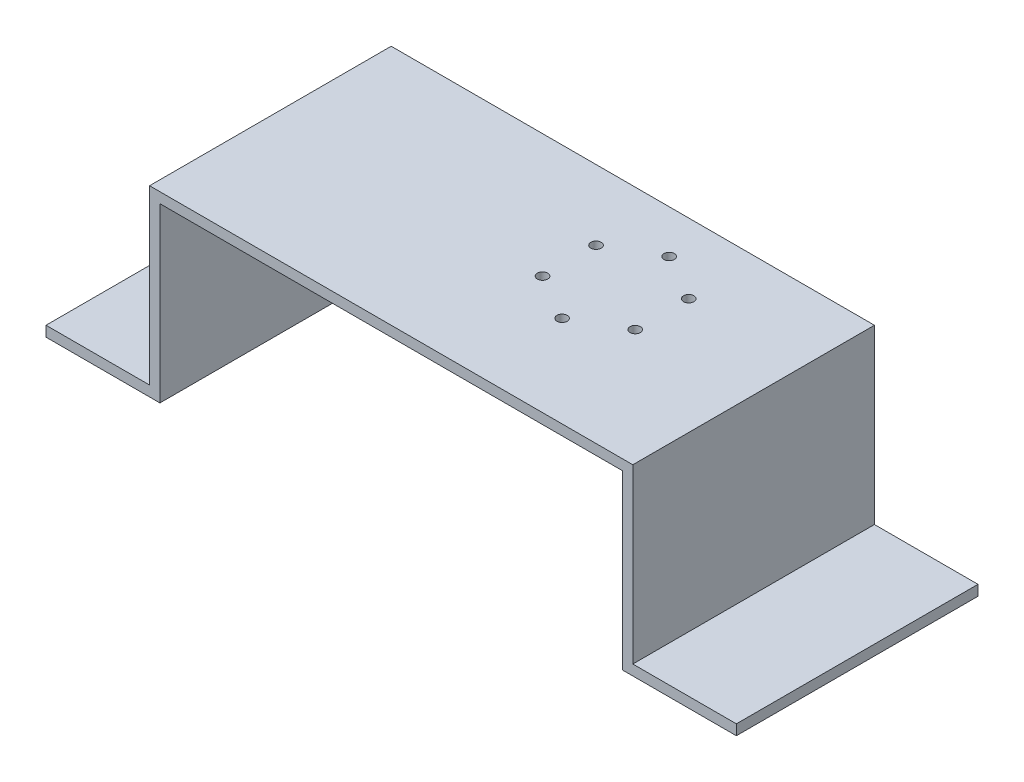
ISO-10303-21;
HEADER;
FILE_DESCRIPTION(('STEP AP214'),'2;1');
FILE_NAME('part.step','',(''),(''),'','','');
FILE_SCHEMA(('AUTOMOTIVE_DESIGN { 1 0 10303 214 1 1 1 1 }'));
ENDSEC;
DATA;
#1=APPLICATION_CONTEXT('core data for automotive mechanical design processes');
#2=APPLICATION_PROTOCOL_DEFINITION('international standard','automotive_design',2000,#1);
#3=PRODUCT_CONTEXT('',#1,'mechanical');
#4=PRODUCT('Part','Part','',(#3));
#5=PRODUCT_RELATED_PRODUCT_CATEGORY('part','',(#4));
#6=PRODUCT_DEFINITION_FORMATION('','',#4);
#7=PRODUCT_DEFINITION_CONTEXT('part definition',#1,'design');
#8=PRODUCT_DEFINITION('design','',#6,#7);
#9=PRODUCT_DEFINITION_SHAPE('','',#8);
#10=(LENGTH_UNIT() NAMED_UNIT(*) SI_UNIT(.MILLI.,.METRE.));
#11=(NAMED_UNIT(*) PLANE_ANGLE_UNIT() SI_UNIT($,.RADIAN.));
#12=(NAMED_UNIT(*) SI_UNIT($,.STERADIAN.) SOLID_ANGLE_UNIT());
#13=UNCERTAINTY_MEASURE_WITH_UNIT(LENGTH_MEASURE(1.E-05),#10,'distance_accuracy_value','');
#14=(GEOMETRIC_REPRESENTATION_CONTEXT(3) GLOBAL_UNCERTAINTY_ASSIGNED_CONTEXT((#13)) GLOBAL_UNIT_ASSIGNED_CONTEXT((#10,
#11,#12)) REPRESENTATION_CONTEXT('',''));
#15=CARTESIAN_POINT('',(0.,0.,0.));
#16=DIRECTION('',(0.,0.,1.));
#17=DIRECTION('',(1.,0.,0.));
#18=AXIS2_PLACEMENT_3D('',#15,#16,#17);
#19=CARTESIAN_POINT('',(0.,0.,70.));
#20=DIRECTION('',(1.,0.,0.));
#21=DIRECTION('',(0.,0.,-1.));
#22=AXIS2_PLACEMENT_3D('',#19,#20,#21);
#23=PLANE('',#22);
#24=DIRECTION('',(0.,-1.,0.));
#25=VECTOR('',#24,1.);
#26=CARTESIAN_POINT('',(0.,0.,0.));
#27=LINE('',#26,#25);
#28=CARTESIAN_POINT('',(0.,0.,0.));
#29=VERTEX_POINT('',#28);
#30=CARTESIAN_POINT('',(0.,-3.,0.));
#31=VERTEX_POINT('',#30);
#32=EDGE_CURVE('E155',#29,#31,#27,.T.);
#33=ORIENTED_EDGE('',*,*,#32,.T.);
#34=DIRECTION('',(0.,0.,-1.));
#35=VECTOR('',#34,1.);
#36=CARTESIAN_POINT('',(0.,-3.,70.));
#37=LINE('',#36,#35);
#38=CARTESIAN_POINT('',(0.,-3.,70.));
#39=VERTEX_POINT('',#38);
#40=EDGE_CURVE('E11',#39,#31,#37,.T.);
#41=ORIENTED_EDGE('',*,*,#40,.F.);
#42=DIRECTION('',(0.,-1.,0.));
#43=VECTOR('',#42,1.);
#44=CARTESIAN_POINT('',(0.,0.,70.));
#45=LINE('',#44,#43);
#46=CARTESIAN_POINT('',(0.,0.,70.));
#47=VERTEX_POINT('',#46);
#48=EDGE_CURVE('E178',#47,#39,#45,.T.);
#49=ORIENTED_EDGE('',*,*,#48,.F.);
#50=DIRECTION('',(0.,0.,-1.));
#51=VECTOR('',#50,1.);
#52=CARTESIAN_POINT('',(0.,0.,70.));
#53=LINE('',#52,#51);
#54=EDGE_CURVE('E151',#47,#29,#53,.T.);
#55=ORIENTED_EDGE('',*,*,#54,.T.);
#56=EDGE_LOOP('',(#33,#41,#49,#55));
#57=FACE_BOUND('',#56,.T.);
#58=ADVANCED_FACE('F35',(#57),#23,.F.);
#59=CARTESIAN_POINT('',(0.,-3.,70.));
#60=DIRECTION('',(0.,1.,0.));
#61=DIRECTION('',(0.,0.,1.));
#62=AXIS2_PLACEMENT_3D('',#59,#60,#61);
#63=PLANE('',#62);
#64=DIRECTION('',(1.,0.,0.));
#65=VECTOR('',#64,1.);
#66=CARTESIAN_POINT('',(0.,-3.,0.));
#67=LINE('',#66,#65);
#68=CARTESIAN_POINT('',(33.,-3.,0.));
#69=VERTEX_POINT('',#68);
#70=EDGE_CURVE('E158',#31,#69,#67,.T.);
#71=ORIENTED_EDGE('',*,*,#70,.T.);
#72=DIRECTION('',(0.,0.,-1.));
#73=VECTOR('',#72,1.);
#74=CARTESIAN_POINT('',(33.,-3.,70.));
#75=LINE('',#74,#73);
#76=CARTESIAN_POINT('',(33.,-3.,70.));
#77=VERTEX_POINT('',#76);
#78=EDGE_CURVE('E43',#77,#69,#75,.T.);
#79=ORIENTED_EDGE('',*,*,#78,.F.);
#80=DIRECTION('',(1.,0.,0.));
#81=VECTOR('',#80,1.);
#82=CARTESIAN_POINT('',(0.,-3.,70.));
#83=LINE('',#82,#81);
#84=EDGE_CURVE('E106',#39,#77,#83,.T.);
#85=ORIENTED_EDGE('',*,*,#84,.F.);
#86=ORIENTED_EDGE('',*,*,#40,.T.);
#87=EDGE_LOOP('',(#71,#79,#85,#86));
#88=FACE_BOUND('',#87,.T.);
#89=ADVANCED_FACE('F256',(#88),#63,.F.);
#90=CARTESIAN_POINT('',(33.,-3.,70.));
#91=DIRECTION('',(-1.,0.,0.));
#92=DIRECTION('',(0.,0.,1.));
#93=AXIS2_PLACEMENT_3D('',#90,#91,#92);
#94=PLANE('',#93);
#95=DIRECTION('',(0.,1.,0.));
#96=VECTOR('',#95,1.);
#97=CARTESIAN_POINT('',(33.,-3.,0.));
#98=LINE('',#97,#96);
#99=CARTESIAN_POINT('',(33.,47.,0.));
#100=VERTEX_POINT('',#99);
#101=EDGE_CURVE('E161',#69,#100,#98,.T.);
#102=ORIENTED_EDGE('',*,*,#101,.T.);
#103=DIRECTION('',(0.,0.,-1.));
#104=VECTOR('',#103,1.);
#105=CARTESIAN_POINT('',(33.,47.,70.));
#106=LINE('',#105,#104);
#107=CARTESIAN_POINT('',(33.,47.,70.));
#108=VERTEX_POINT('',#107);
#109=EDGE_CURVE('E197',#108,#100,#106,.T.);
#110=ORIENTED_EDGE('',*,*,#109,.F.);
#111=DIRECTION('',(0.,1.,0.));
#112=VECTOR('',#111,1.);
#113=CARTESIAN_POINT('',(33.,-3.,70.));
#114=LINE('',#113,#112);
#115=EDGE_CURVE('E205',#77,#108,#114,.T.);
#116=ORIENTED_EDGE('',*,*,#115,.F.);
#117=ORIENTED_EDGE('',*,*,#78,.T.);
#118=EDGE_LOOP('',(#102,#110,#116,#117));
#119=FACE_BOUND('',#118,.T.);
#120=ADVANCED_FACE('F203',(#119),#94,.F.);
#121=CARTESIAN_POINT('',(33.,47.,70.));
#122=DIRECTION('',(0.,1.,0.));
#123=DIRECTION('',(0.,0.,1.));
#124=AXIS2_PLACEMENT_3D('',#121,#122,#123);
#125=PLANE('',#124);
#126=CARTESIAN_POINT('',(136.441405351868,47.,35.7499999987445));
#127=DIRECTION('',(0.,1.,0.));
#128=DIRECTION('',(0.,0.,1.));
#129=AXIS2_PLACEMENT_3D('',#126,#127,#128);
#130=CIRCLE('',#129,1.5);
#131=CARTESIAN_POINT('',(136.441405351868,47.,37.2499999987445));
#132=VERTEX_POINT('',#131);
#133=EDGE_CURVE('E311',#132,#132,#130,.T.);
#134=ORIENTED_EDGE('',*,*,#133,.T.);
#135=EDGE_LOOP('',(#134));
#136=FACE_BOUND('',#135,.T.);
#137=CARTESIAN_POINT('',(136.441405351868,47.,20.2499999987445));
#138=DIRECTION('',(0.,1.,0.));
#139=DIRECTION('',(0.,0.,1.));
#140=AXIS2_PLACEMENT_3D('',#137,#138,#139);
#141=CIRCLE('',#140,1.5);
#142=CARTESIAN_POINT('',(136.441405351868,47.,21.7499999987445));
#143=VERTEX_POINT('',#142);
#144=EDGE_CURVE('E316',#143,#143,#141,.T.);
#145=ORIENTED_EDGE('',*,*,#144,.T.);
#146=EDGE_LOOP('',(#145));
#147=FACE_BOUND('',#146,.T.);
#148=CARTESIAN_POINT('',(123.018011593209,47.,12.499999998745));
#149=DIRECTION('',(0.,1.,0.));
#150=DIRECTION('',(0.,0.,1.));
#151=AXIS2_PLACEMENT_3D('',#148,#149,#150);
#152=CIRCLE('',#151,1.49999999999998);
#153=CARTESIAN_POINT('',(123.018011593209,47.,13.999999998745));
#154=VERTEX_POINT('',#153);
#155=EDGE_CURVE('E323',#154,#154,#152,.T.);
#156=ORIENTED_EDGE('',*,*,#155,.T.);
#157=EDGE_LOOP('',(#156));
#158=FACE_BOUND('',#157,.T.);
#159=CARTESIAN_POINT('',(109.594617834551,47.,35.7499999987456));
#160=DIRECTION('',(0.,1.,0.));
#161=DIRECTION('',(0.,0.,1.));
#162=AXIS2_PLACEMENT_3D('',#159,#160,#161);
#163=CIRCLE('',#162,1.5);
#164=CARTESIAN_POINT('',(109.594617834551,47.,37.2499999987456));
#165=VERTEX_POINT('',#164);
#166=EDGE_CURVE('E326',#165,#165,#163,.T.);
#167=ORIENTED_EDGE('',*,*,#166,.T.);
#168=EDGE_LOOP('',(#167));
#169=FACE_BOUND('',#168,.T.);
#170=CARTESIAN_POINT('',(109.59461783455,47.,20.2499999987456));
#171=DIRECTION('',(0.,1.,0.));
#172=DIRECTION('',(0.,0.,1.));
#173=AXIS2_PLACEMENT_3D('',#170,#171,#172);
#174=CIRCLE('',#173,1.5);
#175=CARTESIAN_POINT('',(109.59461783455,47.,21.7499999987456));
#176=VERTEX_POINT('',#175);
#177=EDGE_CURVE('E329',#176,#176,#174,.T.);
#178=ORIENTED_EDGE('',*,*,#177,.T.);
#179=EDGE_LOOP('',(#178));
#180=FACE_BOUND('',#179,.T.);
#181=CARTESIAN_POINT('',(123.01801159321,47.,43.499999998745));
#182=DIRECTION('',(0.,1.,0.));
#183=DIRECTION('',(0.,0.,1.));
#184=AXIS2_PLACEMENT_3D('',#181,#182,#183);
#185=CIRCLE('',#184,1.49999999999998);
#186=CARTESIAN_POINT('',(123.01801159321,47.,44.999999998745));
#187=VERTEX_POINT('',#186);
#188=EDGE_CURVE('E159',#187,#187,#185,.T.);
#189=ORIENTED_EDGE('',*,*,#188,.T.);
#190=EDGE_LOOP('',(#189));
#191=FACE_BOUND('',#190,.T.);
#192=DIRECTION('',(1.,0.,0.));
#193=VECTOR('',#192,1.);
#194=CARTESIAN_POINT('',(33.,47.,0.));
#195=LINE('',#194,#193);
#196=CARTESIAN_POINT('',(167.,47.,0.));
#197=VERTEX_POINT('',#196);
#198=EDGE_CURVE('E163',#100,#197,#195,.T.);
#199=ORIENTED_EDGE('',*,*,#198,.T.);
#200=DIRECTION('',(0.,0.,-1.));
#201=VECTOR('',#200,1.);
#202=CARTESIAN_POINT('',(167.,47.,70.));
#203=LINE('',#202,#201);
#204=CARTESIAN_POINT('',(167.,47.,70.));
#205=VERTEX_POINT('',#204);
#206=EDGE_CURVE('E194',#205,#197,#203,.T.);
#207=ORIENTED_EDGE('',*,*,#206,.F.);
#208=DIRECTION('',(1.,0.,0.));
#209=VECTOR('',#208,1.);
#210=CARTESIAN_POINT('',(33.,47.,70.));
#211=LINE('',#210,#209);
#212=EDGE_CURVE('E223',#108,#205,#211,.T.);
#213=ORIENTED_EDGE('',*,*,#212,.F.);
#214=ORIENTED_EDGE('',*,*,#109,.T.);
#215=EDGE_LOOP('',(#199,#207,#213,#214));
#216=FACE_BOUND('',#215,.T.);
#217=ADVANCED_FACE('F214',(#136,#147,#158,#169,#180,#191,#216),#125,.F.);
#218=CARTESIAN_POINT('',(167.,47.,70.));
#219=DIRECTION('',(1.,0.,0.));
#220=DIRECTION('',(0.,0.,-1.));
#221=AXIS2_PLACEMENT_3D('',#218,#219,#220);
#222=PLANE('',#221);
#223=DIRECTION('',(0.,-1.,0.));
#224=VECTOR('',#223,1.);
#225=CARTESIAN_POINT('',(167.,47.,0.));
#226=LINE('',#225,#224);
#227=CARTESIAN_POINT('',(167.,-3.,0.));
#228=VERTEX_POINT('',#227);
#229=EDGE_CURVE('E165',#197,#228,#226,.T.);
#230=ORIENTED_EDGE('',*,*,#229,.T.);
#231=DIRECTION('',(0.,0.,-1.));
#232=VECTOR('',#231,1.);
#233=CARTESIAN_POINT('',(167.,-3.,70.));
#234=LINE('',#233,#232);
#235=CARTESIAN_POINT('',(167.,-3.,70.));
#236=VERTEX_POINT('',#235);
#237=EDGE_CURVE('E191',#236,#228,#234,.T.);
#238=ORIENTED_EDGE('',*,*,#237,.F.);
#239=DIRECTION('',(0.,-1.,0.));
#240=VECTOR('',#239,1.);
#241=CARTESIAN_POINT('',(167.,47.,70.));
#242=LINE('',#241,#240);
#243=EDGE_CURVE('E220',#205,#236,#242,.T.);
#244=ORIENTED_EDGE('',*,*,#243,.F.);
#245=ORIENTED_EDGE('',*,*,#206,.T.);
#246=EDGE_LOOP('',(#230,#238,#244,#245));
#247=FACE_BOUND('',#246,.T.);
#248=ADVANCED_FACE('F218',(#247),#222,.F.);
#249=CARTESIAN_POINT('',(167.,-3.,70.));
#250=DIRECTION('',(0.,1.,0.));
#251=DIRECTION('',(0.,0.,1.));
#252=AXIS2_PLACEMENT_3D('',#249,#250,#251);
#253=PLANE('',#252);
#254=DIRECTION('',(1.,0.,0.));
#255=VECTOR('',#254,1.);
#256=CARTESIAN_POINT('',(167.,-3.,0.));
#257=LINE('',#256,#255);
#258=CARTESIAN_POINT('',(200.,-3.,0.));
#259=VERTEX_POINT('',#258);
#260=EDGE_CURVE('E167',#228,#259,#257,.T.);
#261=ORIENTED_EDGE('',*,*,#260,.T.);
#262=DIRECTION('',(0.,0.,-1.));
#263=VECTOR('',#262,1.);
#264=CARTESIAN_POINT('',(200.,-3.,70.));
#265=LINE('',#264,#263);
#266=CARTESIAN_POINT('',(200.,-3.,70.));
#267=VERTEX_POINT('',#266);
#268=EDGE_CURVE('E188',#267,#259,#265,.T.);
#269=ORIENTED_EDGE('',*,*,#268,.F.);
#270=DIRECTION('',(1.,0.,0.));
#271=VECTOR('',#270,1.);
#272=CARTESIAN_POINT('',(167.,-3.,70.));
#273=LINE('',#272,#271);
#274=EDGE_CURVE('E222',#236,#267,#273,.T.);
#275=ORIENTED_EDGE('',*,*,#274,.F.);
#276=ORIENTED_EDGE('',*,*,#237,.T.);
#277=EDGE_LOOP('',(#261,#269,#275,#276));
#278=FACE_BOUND('',#277,.T.);
#279=ADVANCED_FACE('F270',(#278),#253,.F.);
#280=CARTESIAN_POINT('',(200.,0.,70.));
#281=DIRECTION('',(-1.,0.,0.));
#282=DIRECTION('',(0.,0.,1.));
#283=AXIS2_PLACEMENT_3D('',#280,#281,#282);
#284=PLANE('',#283);
#285=DIRECTION('',(0.,1.,0.));
#286=VECTOR('',#285,1.);
#287=CARTESIAN_POINT('',(200.,0.,0.));
#288=LINE('',#287,#286);
#289=CARTESIAN_POINT('',(200.,0.,0.));
#290=VERTEX_POINT('',#289);
#291=EDGE_CURVE('E169',#259,#290,#288,.T.);
#292=ORIENTED_EDGE('',*,*,#291,.T.);
#293=DIRECTION('',(0.,0.,-1.));
#294=VECTOR('',#293,1.);
#295=CARTESIAN_POINT('',(200.,0.,70.));
#296=LINE('',#295,#294);
#297=CARTESIAN_POINT('',(200.,0.,70.));
#298=VERTEX_POINT('',#297);
#299=EDGE_CURVE('E185',#298,#290,#296,.T.);
#300=ORIENTED_EDGE('',*,*,#299,.F.);
#301=DIRECTION('',(0.,1.,0.));
#302=VECTOR('',#301,1.);
#303=CARTESIAN_POINT('',(200.,0.,70.));
#304=LINE('',#303,#302);
#305=EDGE_CURVE('E225',#267,#298,#304,.T.);
#306=ORIENTED_EDGE('',*,*,#305,.F.);
#307=ORIENTED_EDGE('',*,*,#268,.T.);
#308=EDGE_LOOP('',(#292,#300,#306,#307));
#309=FACE_BOUND('',#308,.T.);
#310=ADVANCED_FACE('F273',(#309),#284,.F.);
#311=CARTESIAN_POINT('',(170.,0.,70.));
#312=DIRECTION('',(0.,-1.,0.));
#313=DIRECTION('',(0.,0.,-1.));
#314=AXIS2_PLACEMENT_3D('',#311,#312,#313);
#315=PLANE('',#314);
#316=DIRECTION('',(-1.,0.,0.));
#317=VECTOR('',#316,1.);
#318=CARTESIAN_POINT('',(170.,0.,0.));
#319=LINE('',#318,#317);
#320=CARTESIAN_POINT('',(170.,0.,0.));
#321=VERTEX_POINT('',#320);
#322=EDGE_CURVE('E171',#290,#321,#319,.T.);
#323=ORIENTED_EDGE('',*,*,#322,.T.);
#324=DIRECTION('',(0.,0.,-1.));
#325=VECTOR('',#324,1.);
#326=CARTESIAN_POINT('',(170.,0.,70.));
#327=LINE('',#326,#325);
#328=CARTESIAN_POINT('',(170.,0.,70.));
#329=VERTEX_POINT('',#328);
#330=EDGE_CURVE('E182',#329,#321,#327,.T.);
#331=ORIENTED_EDGE('',*,*,#330,.F.);
#332=DIRECTION('',(-1.,0.,0.));
#333=VECTOR('',#332,1.);
#334=CARTESIAN_POINT('',(170.,0.,70.));
#335=LINE('',#334,#333);
#336=EDGE_CURVE('E231',#298,#329,#335,.T.);
#337=ORIENTED_EDGE('',*,*,#336,.F.);
#338=ORIENTED_EDGE('',*,*,#299,.T.);
#339=EDGE_LOOP('',(#323,#331,#337,#338));
#340=FACE_BOUND('',#339,.T.);
#341=ADVANCED_FACE('F237',(#340),#315,.F.);
#342=CARTESIAN_POINT('',(170.,50.,70.));
#343=DIRECTION('',(-1.,0.,0.));
#344=DIRECTION('',(0.,0.,1.));
#345=AXIS2_PLACEMENT_3D('',#342,#343,#344);
#346=PLANE('',#345);
#347=DIRECTION('',(0.,1.,0.));
#348=VECTOR('',#347,1.);
#349=CARTESIAN_POINT('',(170.,50.,0.));
#350=LINE('',#349,#348);
#351=CARTESIAN_POINT('',(170.,50.,0.));
#352=VERTEX_POINT('',#351);
#353=EDGE_CURVE('E173',#321,#352,#350,.T.);
#354=ORIENTED_EDGE('',*,*,#353,.T.);
#355=DIRECTION('',(0.,0.,-1.));
#356=VECTOR('',#355,1.);
#357=CARTESIAN_POINT('',(170.,50.,70.));
#358=LINE('',#357,#356);
#359=CARTESIAN_POINT('',(170.,50.,70.));
#360=VERTEX_POINT('',#359);
#361=EDGE_CURVE('E146',#360,#352,#358,.T.);
#362=ORIENTED_EDGE('',*,*,#361,.F.);
#363=DIRECTION('',(0.,1.,0.));
#364=VECTOR('',#363,1.);
#365=CARTESIAN_POINT('',(170.,50.,70.));
#366=LINE('',#365,#364);
#367=EDGE_CURVE('E137',#329,#360,#366,.T.);
#368=ORIENTED_EDGE('',*,*,#367,.F.);
#369=ORIENTED_EDGE('',*,*,#330,.T.);
#370=EDGE_LOOP('',(#354,#362,#368,#369));
#371=FACE_BOUND('',#370,.T.);
#372=ADVANCED_FACE('F241',(#371),#346,.F.);
#373=CARTESIAN_POINT('',(30.,50.,70.));
#374=DIRECTION('',(0.,-1.,0.));
#375=DIRECTION('',(0.,0.,-1.));
#376=AXIS2_PLACEMENT_3D('',#373,#374,#375);
#377=PLANE('',#376);
#378=CARTESIAN_POINT('',(136.441405351868,50.,35.7499999987445));
#379=DIRECTION('',(0.,1.,0.));
#380=DIRECTION('',(0.,0.,1.));
#381=AXIS2_PLACEMENT_3D('',#378,#379,#380);
#382=CIRCLE('',#381,1.5);
#383=CARTESIAN_POINT('',(136.441405351868,50.,37.2499999987445));
#384=VERTEX_POINT('',#383);
#385=EDGE_CURVE('E290',#384,#384,#382,.T.);
#386=ORIENTED_EDGE('',*,*,#385,.F.);
#387=EDGE_LOOP('',(#386));
#388=FACE_BOUND('',#387,.T.);
#389=CARTESIAN_POINT('',(136.441405351868,50.,20.2499999987445));
#390=DIRECTION('',(0.,1.,0.));
#391=DIRECTION('',(0.,0.,1.));
#392=AXIS2_PLACEMENT_3D('',#389,#390,#391);
#393=CIRCLE('',#392,1.5);
#394=CARTESIAN_POINT('',(136.441405351868,50.,21.7499999987445));
#395=VERTEX_POINT('',#394);
#396=EDGE_CURVE('E294',#395,#395,#393,.T.);
#397=ORIENTED_EDGE('',*,*,#396,.F.);
#398=EDGE_LOOP('',(#397));
#399=FACE_BOUND('',#398,.T.);
#400=CARTESIAN_POINT('',(123.018011593209,50.,12.499999998745));
#401=DIRECTION('',(0.,1.,0.));
#402=DIRECTION('',(0.,0.,1.));
#403=AXIS2_PLACEMENT_3D('',#400,#401,#402);
#404=CIRCLE('',#403,1.49999999999998);
#405=CARTESIAN_POINT('',(123.018011593209,50.,13.999999998745));
#406=VERTEX_POINT('',#405);
#407=EDGE_CURVE('E298',#406,#406,#404,.T.);
#408=ORIENTED_EDGE('',*,*,#407,.F.);
#409=EDGE_LOOP('',(#408));
#410=FACE_BOUND('',#409,.T.);
#411=CARTESIAN_POINT('',(109.594617834551,50.,35.7499999987456));
#412=DIRECTION('',(0.,1.,0.));
#413=DIRECTION('',(0.,0.,1.));
#414=AXIS2_PLACEMENT_3D('',#411,#412,#413);
#415=CIRCLE('',#414,1.5);
#416=CARTESIAN_POINT('',(109.594617834551,50.,37.2499999987456));
#417=VERTEX_POINT('',#416);
#418=EDGE_CURVE('E302',#417,#417,#415,.T.);
#419=ORIENTED_EDGE('',*,*,#418,.F.);
#420=EDGE_LOOP('',(#419));
#421=FACE_BOUND('',#420,.T.);
#422=CARTESIAN_POINT('',(109.59461783455,50.,20.2499999987456));
#423=DIRECTION('',(0.,1.,0.));
#424=DIRECTION('',(0.,0.,1.));
#425=AXIS2_PLACEMENT_3D('',#422,#423,#424);
#426=CIRCLE('',#425,1.5);
#427=CARTESIAN_POINT('',(109.59461783455,50.,21.7499999987456));
#428=VERTEX_POINT('',#427);
#429=EDGE_CURVE('E306',#428,#428,#426,.T.);
#430=ORIENTED_EDGE('',*,*,#429,.F.);
#431=EDGE_LOOP('',(#430));
#432=FACE_BOUND('',#431,.T.);
#433=CARTESIAN_POINT('',(123.01801159321,50.,43.499999998745));
#434=DIRECTION('',(0.,1.,0.));
#435=DIRECTION('',(0.,0.,1.));
#436=AXIS2_PLACEMENT_3D('',#433,#434,#435);
#437=CIRCLE('',#436,1.49999999999998);
#438=CARTESIAN_POINT('',(123.01801159321,50.,44.999999998745));
#439=VERTEX_POINT('',#438);
#440=EDGE_CURVE('E309',#439,#439,#437,.T.);
#441=ORIENTED_EDGE('',*,*,#440,.F.);
#442=EDGE_LOOP('',(#441));
#443=FACE_BOUND('',#442,.T.);
#444=DIRECTION('',(-1.,0.,0.));
#445=VECTOR('',#444,1.);
#446=CARTESIAN_POINT('',(30.,50.,0.));
#447=LINE('',#446,#445);
#448=CARTESIAN_POINT('',(30.,50.,0.));
#449=VERTEX_POINT('',#448);
#450=EDGE_CURVE('E145',#352,#449,#447,.T.);
#451=ORIENTED_EDGE('',*,*,#450,.T.);
#452=DIRECTION('',(0.,0.,-1.));
#453=VECTOR('',#452,1.);
#454=CARTESIAN_POINT('',(30.,50.,70.));
#455=LINE('',#454,#453);
#456=CARTESIAN_POINT('',(30.,50.,70.));
#457=VERTEX_POINT('',#456);
#458=EDGE_CURVE('E142',#457,#449,#455,.T.);
#459=ORIENTED_EDGE('',*,*,#458,.F.);
#460=DIRECTION('',(-1.,0.,0.));
#461=VECTOR('',#460,1.);
#462=CARTESIAN_POINT('',(30.,50.,70.));
#463=LINE('',#462,#461);
#464=EDGE_CURVE('E131',#360,#457,#463,.T.);
#465=ORIENTED_EDGE('',*,*,#464,.F.);
#466=ORIENTED_EDGE('',*,*,#361,.T.);
#467=EDGE_LOOP('',(#451,#459,#465,#466));
#468=FACE_BOUND('',#467,.T.);
#469=ADVANCED_FACE('F143',(#388,#399,#410,#421,#432,#443,#468),#377,.F.);
#470=CARTESIAN_POINT('',(30.,0.,70.));
#471=DIRECTION('',(1.,0.,0.));
#472=DIRECTION('',(0.,0.,-1.));
#473=AXIS2_PLACEMENT_3D('',#470,#471,#472);
#474=PLANE('',#473);
#475=DIRECTION('',(0.,-1.,0.));
#476=VECTOR('',#475,1.);
#477=CARTESIAN_POINT('',(30.,0.,0.));
#478=LINE('',#477,#476);
#479=CARTESIAN_POINT('',(30.,0.,0.));
#480=VERTEX_POINT('',#479);
#481=EDGE_CURVE('E92',#449,#480,#478,.T.);
#482=ORIENTED_EDGE('',*,*,#481,.T.);
#483=DIRECTION('',(0.,0.,-1.));
#484=VECTOR('',#483,1.);
#485=CARTESIAN_POINT('',(30.,0.,70.));
#486=LINE('',#485,#484);
#487=CARTESIAN_POINT('',(30.,0.,70.));
#488=VERTEX_POINT('',#487);
#489=EDGE_CURVE('E147',#488,#480,#486,.T.);
#490=ORIENTED_EDGE('',*,*,#489,.F.);
#491=DIRECTION('',(0.,-1.,0.));
#492=VECTOR('',#491,1.);
#493=CARTESIAN_POINT('',(30.,0.,70.));
#494=LINE('',#493,#492);
#495=EDGE_CURVE('E135',#457,#488,#494,.T.);
#496=ORIENTED_EDGE('',*,*,#495,.F.);
#497=ORIENTED_EDGE('',*,*,#458,.T.);
#498=EDGE_LOOP('',(#482,#490,#496,#497));
#499=FACE_BOUND('',#498,.T.);
#500=ADVANCED_FACE('F149',(#499),#474,.F.);
#501=CARTESIAN_POINT('',(0.,0.,70.));
#502=DIRECTION('',(0.,-1.,0.));
#503=DIRECTION('',(0.,0.,-1.));
#504=AXIS2_PLACEMENT_3D('',#501,#502,#503);
#505=PLANE('',#504);
#506=DIRECTION('',(-1.,0.,0.));
#507=VECTOR('',#506,1.);
#508=CARTESIAN_POINT('',(0.,0.,0.));
#509=LINE('',#508,#507);
#510=EDGE_CURVE('E98',#480,#29,#509,.T.);
#511=ORIENTED_EDGE('',*,*,#510,.T.);
#512=ORIENTED_EDGE('',*,*,#54,.F.);
#513=DIRECTION('',(-1.,0.,0.));
#514=VECTOR('',#513,1.);
#515=CARTESIAN_POINT('',(0.,0.,70.));
#516=LINE('',#515,#514);
#517=EDGE_CURVE('E51',#488,#47,#516,.T.);
#518=ORIENTED_EDGE('',*,*,#517,.F.);
#519=ORIENTED_EDGE('',*,*,#489,.T.);
#520=EDGE_LOOP('',(#511,#512,#518,#519));
#521=FACE_BOUND('',#520,.T.);
#522=ADVANCED_FACE('F245',(#521),#505,.F.);
#523=CARTESIAN_POINT('',(0.,0.,70.));
#524=DIRECTION('',(0.,0.,1.));
#525=DIRECTION('',(1.,0.,0.));
#526=AXIS2_PLACEMENT_3D('',#523,#524,#525);
#527=PLANE('',#526);
#528=ORIENTED_EDGE('',*,*,#48,.T.);
#529=ORIENTED_EDGE('',*,*,#84,.T.);
#530=ORIENTED_EDGE('',*,*,#115,.T.);
#531=ORIENTED_EDGE('',*,*,#212,.T.);
#532=ORIENTED_EDGE('',*,*,#243,.T.);
#533=ORIENTED_EDGE('',*,*,#274,.T.);
#534=ORIENTED_EDGE('',*,*,#305,.T.);
#535=ORIENTED_EDGE('',*,*,#336,.T.);
#536=ORIENTED_EDGE('',*,*,#367,.T.);
#537=ORIENTED_EDGE('',*,*,#464,.T.);
#538=ORIENTED_EDGE('',*,*,#495,.T.);
#539=ORIENTED_EDGE('',*,*,#517,.T.);
#540=EDGE_LOOP('',(#528,#529,#530,#531,#532,#533,#534,#535,#536,#537,#538,#539));
#541=FACE_BOUND('',#540,.T.);
#542=ADVANCED_FACE('F133',(#541),#527,.T.);
#543=CARTESIAN_POINT('',(0.,0.,0.));
#544=DIRECTION('',(0.,0.,1.));
#545=DIRECTION('',(1.,0.,0.));
#546=AXIS2_PLACEMENT_3D('',#543,#544,#545);
#547=PLANE('',#546);
#548=ORIENTED_EDGE('',*,*,#32,.F.);
#549=ORIENTED_EDGE('',*,*,#510,.F.);
#550=ORIENTED_EDGE('',*,*,#481,.F.);
#551=ORIENTED_EDGE('',*,*,#450,.F.);
#552=ORIENTED_EDGE('',*,*,#353,.F.);
#553=ORIENTED_EDGE('',*,*,#322,.F.);
#554=ORIENTED_EDGE('',*,*,#291,.F.);
#555=ORIENTED_EDGE('',*,*,#260,.F.);
#556=ORIENTED_EDGE('',*,*,#229,.F.);
#557=ORIENTED_EDGE('',*,*,#198,.F.);
#558=ORIENTED_EDGE('',*,*,#101,.F.);
#559=ORIENTED_EDGE('',*,*,#70,.F.);
#560=EDGE_LOOP('',(#548,#549,#550,#551,#552,#553,#554,#555,#556,#557,#558,#559));
#561=FACE_BOUND('',#560,.T.);
#562=ADVANCED_FACE('F209',(#561),#547,.F.);
#563=CARTESIAN_POINT('',(123.01801159321,40.,43.499999998745));
#564=DIRECTION('',(0.,1.,0.));
#565=DIRECTION('',(0.,0.,1.));
#566=AXIS2_PLACEMENT_3D('',#563,#564,#565);
#567=CYLINDRICAL_SURFACE('',#566,1.49999999999998);
#568=ORIENTED_EDGE('',*,*,#440,.T.);
#569=EDGE_LOOP('',(#568));
#570=FACE_BOUND('',#569,.T.);
#571=ORIENTED_EDGE('',*,*,#188,.F.);
#572=EDGE_LOOP('',(#571));
#573=FACE_BOUND('',#572,.T.);
#574=ADVANCED_FACE('F354',(#570,#573),#567,.F.);
#575=CARTESIAN_POINT('',(109.59461783455,40.,20.2499999987456));
#576=DIRECTION('',(0.,1.,0.));
#577=DIRECTION('',(0.,0.,1.));
#578=AXIS2_PLACEMENT_3D('',#575,#576,#577);
#579=CYLINDRICAL_SURFACE('',#578,1.5);
#580=ORIENTED_EDGE('',*,*,#429,.T.);
#581=EDGE_LOOP('',(#580));
#582=FACE_BOUND('',#581,.T.);
#583=ORIENTED_EDGE('',*,*,#177,.F.);
#584=EDGE_LOOP('',(#583));
#585=FACE_BOUND('',#584,.T.);
#586=ADVANCED_FACE('F356',(#582,#585),#579,.F.);
#587=CARTESIAN_POINT('',(109.594617834551,40.,35.7499999987456));
#588=DIRECTION('',(0.,1.,0.));
#589=DIRECTION('',(0.,0.,1.));
#590=AXIS2_PLACEMENT_3D('',#587,#588,#589);
#591=CYLINDRICAL_SURFACE('',#590,1.5);
#592=ORIENTED_EDGE('',*,*,#418,.T.);
#593=EDGE_LOOP('',(#592));
#594=FACE_BOUND('',#593,.T.);
#595=ORIENTED_EDGE('',*,*,#166,.F.);
#596=EDGE_LOOP('',(#595));
#597=FACE_BOUND('',#596,.T.);
#598=ADVANCED_FACE('F361',(#594,#597),#591,.F.);
#599=CARTESIAN_POINT('',(123.018011593209,40.,12.499999998745));
#600=DIRECTION('',(0.,1.,0.));
#601=DIRECTION('',(0.,0.,1.));
#602=AXIS2_PLACEMENT_3D('',#599,#600,#601);
#603=CYLINDRICAL_SURFACE('',#602,1.49999999999998);
#604=ORIENTED_EDGE('',*,*,#407,.T.);
#605=EDGE_LOOP('',(#604));
#606=FACE_BOUND('',#605,.T.);
#607=ORIENTED_EDGE('',*,*,#155,.F.);
#608=EDGE_LOOP('',(#607));
#609=FACE_BOUND('',#608,.T.);
#610=ADVANCED_FACE('F367',(#606,#609),#603,.F.);
#611=CARTESIAN_POINT('',(136.441405351868,40.,20.2499999987445));
#612=DIRECTION('',(0.,1.,0.));
#613=DIRECTION('',(0.,0.,1.));
#614=AXIS2_PLACEMENT_3D('',#611,#612,#613);
#615=CYLINDRICAL_SURFACE('',#614,1.5);
#616=ORIENTED_EDGE('',*,*,#396,.T.);
#617=EDGE_LOOP('',(#616));
#618=FACE_BOUND('',#617,.T.);
#619=ORIENTED_EDGE('',*,*,#144,.F.);
#620=EDGE_LOOP('',(#619));
#621=FACE_BOUND('',#620,.T.);
#622=ADVANCED_FACE('F340',(#618,#621),#615,.F.);
#623=CARTESIAN_POINT('',(136.441405351868,40.,35.7499999987445));
#624=DIRECTION('',(0.,1.,0.));
#625=DIRECTION('',(0.,0.,1.));
#626=AXIS2_PLACEMENT_3D('',#623,#624,#625);
#627=CYLINDRICAL_SURFACE('',#626,1.5);
#628=ORIENTED_EDGE('',*,*,#385,.T.);
#629=EDGE_LOOP('',(#628));
#630=FACE_BOUND('',#629,.T.);
#631=ORIENTED_EDGE('',*,*,#133,.F.);
#632=EDGE_LOOP('',(#631));
#633=FACE_BOUND('',#632,.T.);
#634=ADVANCED_FACE('F337',(#630,#633),#627,.F.);
#635=CLOSED_SHELL('',(#58,#89,#120,#217,#248,#279,#310,#341,#372,#469,#500,#522,#542,#562,#574,
#586,#598,#610,#622,#634));
#636=MANIFOLD_SOLID_BREP('B2',#635);
#637=ADVANCED_BREP_SHAPE_REPRESENTATION('',(#18,#636),#14);
#638=SHAPE_DEFINITION_REPRESENTATION(#9,#637);
ENDSEC;
END-ISO-10303-21;
